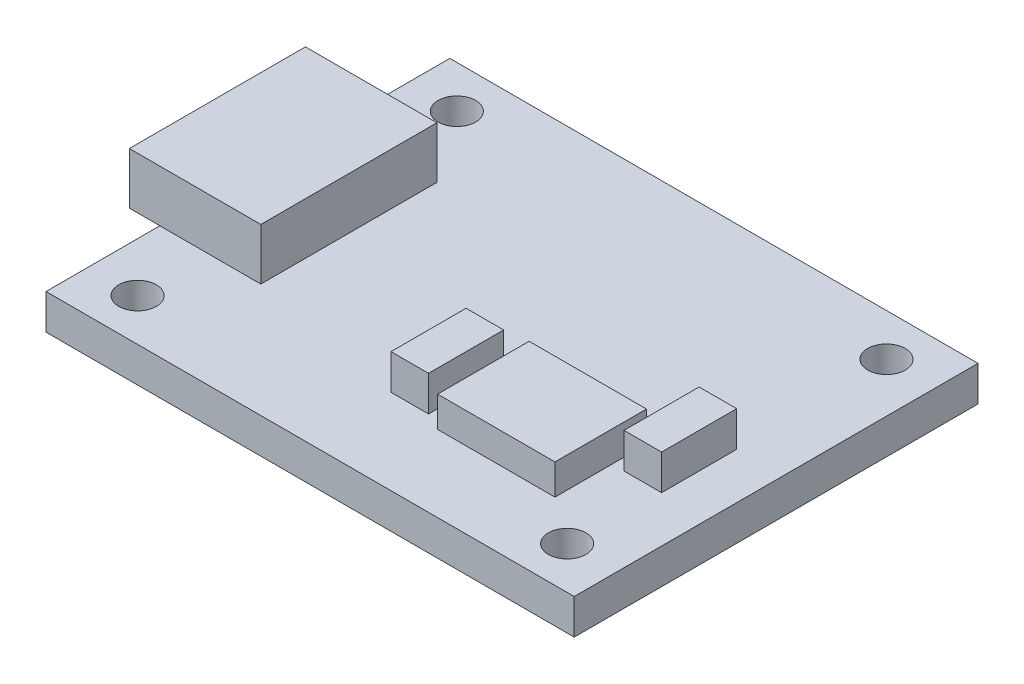
ISO-10303-21;
HEADER;
FILE_DESCRIPTION(('STEP AP214'),'2;1');
FILE_NAME('part.step','',(''),(''),'','','');
FILE_SCHEMA(('AUTOMOTIVE_DESIGN { 1 0 10303 214 1 1 1 1 }'));
ENDSEC;
DATA;
#1=APPLICATION_CONTEXT('core data for automotive mechanical design processes');
#2=APPLICATION_PROTOCOL_DEFINITION('international standard','automotive_design',2000,#1);
#3=PRODUCT_CONTEXT('',#1,'mechanical');
#4=PRODUCT('Part','Part','',(#3));
#5=PRODUCT_RELATED_PRODUCT_CATEGORY('part','',(#4));
#6=PRODUCT_DEFINITION_FORMATION('','',#4);
#7=PRODUCT_DEFINITION_CONTEXT('part definition',#1,'design');
#8=PRODUCT_DEFINITION('design','',#6,#7);
#9=PRODUCT_DEFINITION_SHAPE('','',#8);
#10=(LENGTH_UNIT() NAMED_UNIT(*) SI_UNIT(.MILLI.,.METRE.));
#11=(NAMED_UNIT(*) PLANE_ANGLE_UNIT() SI_UNIT($,.RADIAN.));
#12=(NAMED_UNIT(*) SI_UNIT($,.STERADIAN.) SOLID_ANGLE_UNIT());
#13=UNCERTAINTY_MEASURE_WITH_UNIT(LENGTH_MEASURE(1.E-05),#10,'distance_accuracy_value','');
#14=(GEOMETRIC_REPRESENTATION_CONTEXT(3) GLOBAL_UNCERTAINTY_ASSIGNED_CONTEXT((#13)) GLOBAL_UNIT_ASSIGNED_CONTEXT((#10,
#11,#12)) REPRESENTATION_CONTEXT('',''));
#15=CARTESIAN_POINT('',(0.,0.,0.));
#16=DIRECTION('',(0.,0.,1.));
#17=DIRECTION('',(1.,0.,0.));
#18=AXIS2_PLACEMENT_3D('',#15,#16,#17);
#19=CARTESIAN_POINT('',(0.,1.5,0.));
#20=DIRECTION('',(0.,-1.,0.));
#21=DIRECTION('',(0.,0.,-1.));
#22=AXIS2_PLACEMENT_3D('',#19,#20,#21);
#23=PLANE('',#22);
#24=CARTESIAN_POINT('',(9.15000000000001,1.5,-6.8));
#25=DIRECTION('',(0.,-1.,0.));
#26=DIRECTION('',(0.,0.,-1.));
#27=AXIS2_PLACEMENT_3D('',#24,#25,#26);
#28=CIRCLE('',#27,0.800000000000001);
#29=CARTESIAN_POINT('',(9.15000000000001,1.5,-7.6));
#30=VERTEX_POINT('',#29);
#31=EDGE_CURVE('E366',#30,#30,#28,.F.);
#32=ORIENTED_EDGE('',*,*,#31,.F.);
#33=EDGE_LOOP('',(#32));
#34=FACE_BOUND('',#33,.T.);
#35=CARTESIAN_POINT('',(9.15,1.5,6.8));
#36=DIRECTION('',(0.,-1.,0.));
#37=DIRECTION('',(0.,0.,-1.));
#38=AXIS2_PLACEMENT_3D('',#35,#36,#37);
#39=CIRCLE('',#38,0.800000000000002);
#40=CARTESIAN_POINT('',(9.15,1.5,6.));
#41=VERTEX_POINT('',#40);
#42=EDGE_CURVE('E664',#41,#41,#39,.F.);
#43=ORIENTED_EDGE('',*,*,#42,.F.);
#44=EDGE_LOOP('',(#43));
#45=FACE_BOUND('',#44,.T.);
#46=CARTESIAN_POINT('',(-9.15,1.5,6.8));
#47=DIRECTION('',(0.,-1.,0.));
#48=DIRECTION('',(0.,0.,-1.));
#49=AXIS2_PLACEMENT_3D('',#46,#47,#48);
#50=CIRCLE('',#49,0.800000000000001);
#51=CARTESIAN_POINT('',(-9.15,1.5,6.));
#52=VERTEX_POINT('',#51);
#53=EDGE_CURVE('E667',#52,#52,#50,.F.);
#54=ORIENTED_EDGE('',*,*,#53,.F.);
#55=EDGE_LOOP('',(#54));
#56=FACE_BOUND('',#55,.T.);
#57=CARTESIAN_POINT('',(-9.15,1.5,-6.8));
#58=DIRECTION('',(0.,-1.,0.));
#59=DIRECTION('',(0.,0.,-1.));
#60=AXIS2_PLACEMENT_3D('',#57,#58,#59);
#61=CIRCLE('',#60,0.800000000000001);
#62=CARTESIAN_POINT('',(-9.15,1.5,-7.6));
#63=VERTEX_POINT('',#62);
#64=EDGE_CURVE('E672',#63,#63,#61,.F.);
#65=ORIENTED_EDGE('',*,*,#64,.F.);
#66=EDGE_LOOP('',(#65));
#67=FACE_BOUND('',#66,.T.);
#68=DIRECTION('',(1.,0.,0.));
#69=VECTOR('',#68,1.);
#70=CARTESIAN_POINT('',(2.17519323471346,1.5,5.34627209754884));
#71=LINE('',#70,#69);
#72=CARTESIAN_POINT('',(2.17519323471346,1.5,5.34627209754884));
#73=VERTEX_POINT('',#72);
#74=CARTESIAN_POINT('',(7.17519323471346,1.5,5.34627209754884));
#75=VERTEX_POINT('',#74);
#76=EDGE_CURVE('E203',#73,#75,#71,.T.);
#77=ORIENTED_EDGE('',*,*,#76,.F.);
#78=DIRECTION('',(0.,0.,-1.));
#79=VECTOR('',#78,1.);
#80=CARTESIAN_POINT('',(2.17519323471346,1.5,5.34627209754884));
#81=LINE('',#80,#79);
#82=CARTESIAN_POINT('',(2.17519323471346,1.5,1.44627209754884));
#83=VERTEX_POINT('',#82);
#84=EDGE_CURVE('E216',#73,#83,#81,.T.);
#85=ORIENTED_EDGE('',*,*,#84,.T.);
#86=DIRECTION('',(1.,0.,0.));
#87=VECTOR('',#86,1.);
#88=CARTESIAN_POINT('',(2.17519323471346,1.5,1.44627209754884));
#89=LINE('',#88,#87);
#90=CARTESIAN_POINT('',(7.17519323471346,1.5,1.44627209754884));
#91=VERTEX_POINT('',#90);
#92=EDGE_CURVE('E227',#83,#91,#89,.T.);
#93=ORIENTED_EDGE('',*,*,#92,.T.);
#94=DIRECTION('',(0.,0.,-1.));
#95=VECTOR('',#94,1.);
#96=CARTESIAN_POINT('',(7.17519323471346,1.5,5.34627209754884));
#97=LINE('',#96,#95);
#98=EDGE_CURVE('E206',#75,#91,#97,.T.);
#99=ORIENTED_EDGE('',*,*,#98,.F.);
#100=EDGE_LOOP('',(#77,#85,#93,#99));
#101=FACE_BOUND('',#100,.T.);
#102=DIRECTION('',(1.,0.,0.));
#103=VECTOR('',#102,1.);
#104=CARTESIAN_POINT('',(0.,1.5,1.77023704739978));
#105=LINE('',#104,#103);
#106=CARTESIAN_POINT('',(-0.185122828486251,1.5,1.77023704739978));
#107=VERTEX_POINT('',#106);
#108=CARTESIAN_POINT('',(1.41487717151375,1.5,1.77023704739978));
#109=VERTEX_POINT('',#108);
#110=EDGE_CURVE('E286',#107,#109,#105,.T.);
#111=ORIENTED_EDGE('',*,*,#110,.T.);
#112=DIRECTION('',(0.,0.,1.));
#113=VECTOR('',#112,1.);
#114=CARTESIAN_POINT('',(1.41487717151375,1.5,0.));
#115=LINE('',#114,#113);
#116=CARTESIAN_POINT('',(1.41487717151375,1.5,4.97023704739978));
#117=VERTEX_POINT('',#116);
#118=EDGE_CURVE('E272',#109,#117,#115,.T.);
#119=ORIENTED_EDGE('',*,*,#118,.T.);
#120=DIRECTION('',(1.,0.,0.));
#121=VECTOR('',#120,1.);
#122=CARTESIAN_POINT('',(0.,1.5,4.97023704739978));
#123=LINE('',#122,#121);
#124=CARTESIAN_POINT('',(-0.185122828486251,1.5,4.97023704739978));
#125=VERTEX_POINT('',#124);
#126=EDGE_CURVE('E277',#125,#117,#123,.T.);
#127=ORIENTED_EDGE('',*,*,#126,.F.);
#128=DIRECTION('',(0.,0.,1.));
#129=VECTOR('',#128,1.);
#130=CARTESIAN_POINT('',(-0.185122828486251,1.5,0.));
#131=LINE('',#130,#129);
#132=EDGE_CURVE('E288',#107,#125,#131,.T.);
#133=ORIENTED_EDGE('',*,*,#132,.F.);
#134=EDGE_LOOP('',(#111,#119,#127,#133));
#135=FACE_BOUND('',#134,.T.);
#136=DIRECTION('',(1.,0.,0.));
#137=VECTOR('',#136,1.);
#138=CARTESIAN_POINT('',(0.,1.5,2.91074558049023));
#139=LINE('',#138,#137);
#140=CARTESIAN_POINT('',(7.68259738217945,1.5,2.91074558049023));
#141=VERTEX_POINT('',#140);
#142=CARTESIAN_POINT('',(9.28259738217945,1.5,2.91074558049023));
#143=VERTEX_POINT('',#142);
#144=EDGE_CURVE('E240',#141,#143,#139,.T.);
#145=ORIENTED_EDGE('',*,*,#144,.F.);
#146=DIRECTION('',(0.,0.,-1.));
#147=VECTOR('',#146,1.);
#148=CARTESIAN_POINT('',(7.68259738217945,1.5,0.));
#149=LINE('',#148,#147);
#150=CARTESIAN_POINT('',(7.68259738217945,1.5,-0.289254419509775));
#151=VERTEX_POINT('',#150);
#152=EDGE_CURVE('E245',#141,#151,#149,.T.);
#153=ORIENTED_EDGE('',*,*,#152,.T.);
#154=DIRECTION('',(1.,0.,0.));
#155=VECTOR('',#154,1.);
#156=CARTESIAN_POINT('',(0.,1.5,-0.289254419509775));
#157=LINE('',#156,#155);
#158=CARTESIAN_POINT('',(9.28259738217945,1.5,-0.289254419509775));
#159=VERTEX_POINT('',#158);
#160=EDGE_CURVE('E259',#151,#159,#157,.T.);
#161=ORIENTED_EDGE('',*,*,#160,.T.);
#162=DIRECTION('',(0.,0.,-1.));
#163=VECTOR('',#162,1.);
#164=CARTESIAN_POINT('',(9.28259738217945,1.5,0.));
#165=LINE('',#164,#163);
#166=EDGE_CURVE('E256',#143,#159,#165,.T.);
#167=ORIENTED_EDGE('',*,*,#166,.F.);
#168=EDGE_LOOP('',(#145,#153,#161,#167));
#169=FACE_BOUND('',#168,.T.);
#170=DIRECTION('',(1.,0.,0.));
#171=VECTOR('',#170,1.);
#172=CARTESIAN_POINT('',(-6.95,1.5,3.75));
#173=LINE('',#172,#171);
#174=CARTESIAN_POINT('',(-11.25,1.5,3.75));
#175=VERTEX_POINT('',#174);
#176=CARTESIAN_POINT('',(-6.95,1.5,3.75));
#177=VERTEX_POINT('',#176);
#178=EDGE_CURVE('E365',#175,#177,#173,.T.);
#179=ORIENTED_EDGE('',*,*,#178,.F.);
#180=DIRECTION('',(0.,0.,1.));
#181=VECTOR('',#180,1.);
#182=CARTESIAN_POINT('',(-11.25,1.5,-8.6));
#183=LINE('',#182,#181);
#184=CARTESIAN_POINT('',(-11.25,1.5,8.6));
#185=VERTEX_POINT('',#184);
#186=EDGE_CURVE('E309',#175,#185,#183,.T.);
#187=ORIENTED_EDGE('',*,*,#186,.T.);
#188=DIRECTION('',(1.,0.,0.));
#189=VECTOR('',#188,1.);
#190=CARTESIAN_POINT('',(11.25,1.5,8.6));
#191=LINE('',#190,#189);
#192=CARTESIAN_POINT('',(11.25,1.5,8.6));
#193=VERTEX_POINT('',#192);
#194=EDGE_CURVE('E307',#185,#193,#191,.T.);
#195=ORIENTED_EDGE('',*,*,#194,.T.);
#196=DIRECTION('',(0.,0.,-1.));
#197=VECTOR('',#196,1.);
#198=CARTESIAN_POINT('',(11.25,1.5,-8.6));
#199=LINE('',#198,#197);
#200=CARTESIAN_POINT('',(11.25,1.5,-8.6));
#201=VERTEX_POINT('',#200);
#202=EDGE_CURVE('E311',#193,#201,#199,.T.);
#203=ORIENTED_EDGE('',*,*,#202,.T.);
#204=DIRECTION('',(-1.,0.,0.));
#205=VECTOR('',#204,1.);
#206=CARTESIAN_POINT('',(11.25,1.5,-8.6));
#207=LINE('',#206,#205);
#208=CARTESIAN_POINT('',(-11.25,1.5,-8.6));
#209=VERTEX_POINT('',#208);
#210=EDGE_CURVE('E313',#201,#209,#207,.T.);
#211=ORIENTED_EDGE('',*,*,#210,.T.);
#212=CARTESIAN_POINT('',(-11.25,1.5,-3.75));
#213=VERTEX_POINT('',#212);
#214=EDGE_CURVE('E305',#209,#213,#183,.T.);
#215=ORIENTED_EDGE('',*,*,#214,.T.);
#216=DIRECTION('',(-1.,0.,0.));
#217=VECTOR('',#216,1.);
#218=CARTESIAN_POINT('',(-6.95,1.5,-3.75));
#219=LINE('',#218,#217);
#220=CARTESIAN_POINT('',(-6.95,1.5,-3.75));
#221=VERTEX_POINT('',#220);
#222=EDGE_CURVE('E55',#221,#213,#219,.T.);
#223=ORIENTED_EDGE('',*,*,#222,.F.);
#224=DIRECTION('',(0.,0.,-1.));
#225=VECTOR('',#224,1.);
#226=CARTESIAN_POINT('',(-6.95,1.5,3.75));
#227=LINE('',#226,#225);
#228=EDGE_CURVE('E50',#177,#221,#227,.T.);
#229=ORIENTED_EDGE('',*,*,#228,.F.);
#230=EDGE_LOOP('',(#179,#187,#195,#203,#211,#215,#223,#229));
#231=FACE_BOUND('',#230,.T.);
#232=ADVANCED_FACE('F35',(#34,#45,#56,#67,#101,#135,#169,#231),#23,.F.);
#233=CARTESIAN_POINT('',(-11.25,1.5,-8.6));
#234=DIRECTION('',(1.,0.,0.));
#235=DIRECTION('',(0.,0.,-1.));
#236=AXIS2_PLACEMENT_3D('',#233,#234,#235);
#237=PLANE('',#236);
#238=DIRECTION('',(0.,0.,1.));
#239=VECTOR('',#238,1.);
#240=CARTESIAN_POINT('',(-11.25,0.,-8.6));
#241=LINE('',#240,#239);
#242=CARTESIAN_POINT('',(-11.25,0.,-8.6));
#243=VERTEX_POINT('',#242);
#244=CARTESIAN_POINT('',(-11.25,0.,8.6));
#245=VERTEX_POINT('',#244);
#246=EDGE_CURVE('E304',#243,#245,#241,.T.);
#247=ORIENTED_EDGE('',*,*,#246,.T.);
#248=DIRECTION('',(0.,-1.,0.));
#249=VECTOR('',#248,1.);
#250=CARTESIAN_POINT('',(-11.25,1.5,8.6));
#251=LINE('',#250,#249);
#252=EDGE_CURVE('E11',#185,#245,#251,.T.);
#253=ORIENTED_EDGE('',*,*,#252,.F.);
#254=ORIENTED_EDGE('',*,*,#186,.F.);
#255=EDGE_CURVE('E308',#213,#175,#183,.T.);
#256=ORIENTED_EDGE('',*,*,#255,.F.);
#257=ORIENTED_EDGE('',*,*,#214,.F.);
#258=DIRECTION('',(0.,-1.,0.));
#259=VECTOR('',#258,1.);
#260=CARTESIAN_POINT('',(-11.25,1.5,-8.6));
#261=LINE('',#260,#259);
#262=EDGE_CURVE('E315',#209,#243,#261,.T.);
#263=ORIENTED_EDGE('',*,*,#262,.T.);
#264=EDGE_LOOP('',(#247,#253,#254,#256,#257,#263));
#265=FACE_BOUND('',#264,.T.);
#266=ADVANCED_FACE('F37',(#265),#237,.F.);
#267=CARTESIAN_POINT('',(11.25,1.5,8.6));
#268=DIRECTION('',(0.,0.,-1.));
#269=DIRECTION('',(-1.,0.,0.));
#270=AXIS2_PLACEMENT_3D('',#267,#268,#269);
#271=PLANE('',#270);
#272=DIRECTION('',(1.,0.,0.));
#273=VECTOR('',#272,1.);
#274=CARTESIAN_POINT('',(11.25,0.,8.6));
#275=LINE('',#274,#273);
#276=CARTESIAN_POINT('',(11.25,0.,8.6));
#277=VERTEX_POINT('',#276);
#278=EDGE_CURVE('E318',#245,#277,#275,.T.);
#279=ORIENTED_EDGE('',*,*,#278,.T.);
#280=DIRECTION('',(0.,-1.,0.));
#281=VECTOR('',#280,1.);
#282=CARTESIAN_POINT('',(11.25,1.5,8.6));
#283=LINE('',#282,#281);
#284=EDGE_CURVE('E43',#193,#277,#283,.T.);
#285=ORIENTED_EDGE('',*,*,#284,.F.);
#286=ORIENTED_EDGE('',*,*,#194,.F.);
#287=ORIENTED_EDGE('',*,*,#252,.T.);
#288=EDGE_LOOP('',(#279,#285,#286,#287));
#289=FACE_BOUND('',#288,.T.);
#290=ADVANCED_FACE('F384',(#289),#271,.F.);
#291=CARTESIAN_POINT('',(11.25,1.5,-8.6));
#292=DIRECTION('',(-1.,0.,0.));
#293=DIRECTION('',(0.,0.,1.));
#294=AXIS2_PLACEMENT_3D('',#291,#292,#293);
#295=PLANE('',#294);
#296=DIRECTION('',(0.,0.,-1.));
#297=VECTOR('',#296,1.);
#298=CARTESIAN_POINT('',(11.25,0.,-8.6));
#299=LINE('',#298,#297);
#300=CARTESIAN_POINT('',(11.25,0.,-8.6));
#301=VERTEX_POINT('',#300);
#302=EDGE_CURVE('E320',#277,#301,#299,.T.);
#303=ORIENTED_EDGE('',*,*,#302,.T.);
#304=DIRECTION('',(0.,-1.,0.));
#305=VECTOR('',#304,1.);
#306=CARTESIAN_POINT('',(11.25,1.5,-8.6));
#307=LINE('',#306,#305);
#308=EDGE_CURVE('E326',#201,#301,#307,.T.);
#309=ORIENTED_EDGE('',*,*,#308,.F.);
#310=ORIENTED_EDGE('',*,*,#202,.F.);
#311=ORIENTED_EDGE('',*,*,#284,.T.);
#312=EDGE_LOOP('',(#303,#309,#310,#311));
#313=FACE_BOUND('',#312,.T.);
#314=ADVANCED_FACE('F333',(#313),#295,.F.);
#315=CARTESIAN_POINT('',(11.25,1.5,-8.6));
#316=DIRECTION('',(0.,0.,1.));
#317=DIRECTION('',(1.,0.,0.));
#318=AXIS2_PLACEMENT_3D('',#315,#316,#317);
#319=PLANE('',#318);
#320=DIRECTION('',(-1.,0.,0.));
#321=VECTOR('',#320,1.);
#322=CARTESIAN_POINT('',(11.25,0.,-8.6));
#323=LINE('',#322,#321);
#324=EDGE_CURVE('E322',#301,#243,#323,.T.);
#325=ORIENTED_EDGE('',*,*,#324,.T.);
#326=ORIENTED_EDGE('',*,*,#262,.F.);
#327=ORIENTED_EDGE('',*,*,#210,.F.);
#328=ORIENTED_EDGE('',*,*,#308,.T.);
#329=EDGE_LOOP('',(#325,#326,#327,#328));
#330=FACE_BOUND('',#329,.T.);
#331=ADVANCED_FACE('F343',(#330),#319,.F.);
#332=CARTESIAN_POINT('',(0.,0.,0.));
#333=DIRECTION('',(0.,-1.,0.));
#334=DIRECTION('',(0.,0.,-1.));
#335=AXIS2_PLACEMENT_3D('',#332,#333,#334);
#336=PLANE('',#335);
#337=CARTESIAN_POINT('',(9.15000000000001,0.,-6.8));
#338=DIRECTION('',(0.,1.,0.));
#339=DIRECTION('',(0.,0.,-1.));
#340=AXIS2_PLACEMENT_3D('',#337,#338,#339);
#341=CIRCLE('',#340,0.800000000000001);
#342=CARTESIAN_POINT('',(9.15000000000001,0.,-7.6));
#343=VERTEX_POINT('',#342);
#344=EDGE_CURVE('E662',#343,#343,#341,.T.);
#345=ORIENTED_EDGE('',*,*,#344,.T.);
#346=EDGE_LOOP('',(#345));
#347=FACE_BOUND('',#346,.T.);
#348=CARTESIAN_POINT('',(9.15,0.,6.8));
#349=DIRECTION('',(0.,1.,0.));
#350=DIRECTION('',(0.,0.,-1.));
#351=AXIS2_PLACEMENT_3D('',#348,#349,#350);
#352=CIRCLE('',#351,0.800000000000002);
#353=CARTESIAN_POINT('',(9.15,0.,6.));
#354=VERTEX_POINT('',#353);
#355=EDGE_CURVE('E680',#354,#354,#352,.T.);
#356=ORIENTED_EDGE('',*,*,#355,.T.);
#357=EDGE_LOOP('',(#356));
#358=FACE_BOUND('',#357,.T.);
#359=CARTESIAN_POINT('',(-9.15,0.,6.8));
#360=DIRECTION('',(0.,1.,0.));
#361=DIRECTION('',(0.,0.,1.));
#362=AXIS2_PLACEMENT_3D('',#359,#360,#361);
#363=CIRCLE('',#362,0.800000000000001);
#364=CARTESIAN_POINT('',(-9.15,0.,7.6));
#365=VERTEX_POINT('',#364);
#366=EDGE_CURVE('E678',#365,#365,#363,.T.);
#367=ORIENTED_EDGE('',*,*,#366,.T.);
#368=EDGE_LOOP('',(#367));
#369=FACE_BOUND('',#368,.T.);
#370=CARTESIAN_POINT('',(-9.15,0.,-6.8));
#371=DIRECTION('',(0.,1.,0.));
#372=DIRECTION('',(0.,0.,1.));
#373=AXIS2_PLACEMENT_3D('',#370,#371,#372);
#374=CIRCLE('',#373,0.800000000000001);
#375=CARTESIAN_POINT('',(-9.15,0.,-6.));
#376=VERTEX_POINT('',#375);
#377=EDGE_CURVE('E675',#376,#376,#374,.T.);
#378=ORIENTED_EDGE('',*,*,#377,.T.);
#379=EDGE_LOOP('',(#378));
#380=FACE_BOUND('',#379,.T.);
#381=ORIENTED_EDGE('',*,*,#246,.F.);
#382=ORIENTED_EDGE('',*,*,#324,.F.);
#383=ORIENTED_EDGE('',*,*,#302,.F.);
#384=ORIENTED_EDGE('',*,*,#278,.F.);
#385=EDGE_LOOP('',(#381,#382,#383,#384));
#386=FACE_BOUND('',#385,.T.);
#387=ADVANCED_FACE('F340',(#347,#358,#369,#380,#386),#336,.T.);
#388=CARTESIAN_POINT('',(1.41487717151375,3.,0.));
#389=DIRECTION('',(1.,0.,0.));
#390=DIRECTION('',(0.,0.,-1.));
#391=AXIS2_PLACEMENT_3D('',#388,#389,#390);
#392=PLANE('',#391);
#393=ORIENTED_EDGE('',*,*,#118,.F.);
#394=DIRECTION('',(0.,-1.,0.));
#395=VECTOR('',#394,1.);
#396=CARTESIAN_POINT('',(1.41487717151375,3.,1.77023704739978));
#397=LINE('',#396,#395);
#398=CARTESIAN_POINT('',(1.41487717151375,3.,1.77023704739978));
#399=VERTEX_POINT('',#398);
#400=EDGE_CURVE('E301',#399,#109,#397,.T.);
#401=ORIENTED_EDGE('',*,*,#400,.F.);
#402=DIRECTION('',(0.,0.,1.));
#403=VECTOR('',#402,1.);
#404=CARTESIAN_POINT('',(1.41487717151375,3.,0.));
#405=LINE('',#404,#403);
#406=CARTESIAN_POINT('',(1.41487717151375,3.,4.97023704739978));
#407=VERTEX_POINT('',#406);
#408=EDGE_CURVE('E273',#399,#407,#405,.T.);
#409=ORIENTED_EDGE('',*,*,#408,.T.);
#410=DIRECTION('',(0.,-1.,0.));
#411=VECTOR('',#410,1.);
#412=CARTESIAN_POINT('',(1.41487717151375,3.,4.97023704739978));
#413=LINE('',#412,#411);
#414=EDGE_CURVE('E284',#407,#117,#413,.T.);
#415=ORIENTED_EDGE('',*,*,#414,.T.);
#416=EDGE_LOOP('',(#393,#401,#409,#415));
#417=FACE_BOUND('',#416,.T.);
#418=ADVANCED_FACE('F389',(#417),#392,.T.);
#419=CARTESIAN_POINT('',(0.,3.,1.77023704739978));
#420=DIRECTION('',(0.,0.,-1.));
#421=DIRECTION('',(-1.,0.,0.));
#422=AXIS2_PLACEMENT_3D('',#419,#420,#421);
#423=PLANE('',#422);
#424=ORIENTED_EDGE('',*,*,#110,.F.);
#425=DIRECTION('',(0.,-1.,0.));
#426=VECTOR('',#425,1.);
#427=CARTESIAN_POINT('',(-0.185122828486251,3.,1.77023704739978));
#428=LINE('',#427,#426);
#429=CARTESIAN_POINT('',(-0.185122828486251,3.,1.77023704739978));
#430=VERTEX_POINT('',#429);
#431=EDGE_CURVE('E298',#430,#107,#428,.T.);
#432=ORIENTED_EDGE('',*,*,#431,.F.);
#433=DIRECTION('',(1.,0.,0.));
#434=VECTOR('',#433,1.);
#435=CARTESIAN_POINT('',(0.,3.,1.77023704739978));
#436=LINE('',#435,#434);
#437=EDGE_CURVE('E276',#430,#399,#436,.T.);
#438=ORIENTED_EDGE('',*,*,#437,.T.);
#439=ORIENTED_EDGE('',*,*,#400,.T.);
#440=EDGE_LOOP('',(#424,#432,#438,#439));
#441=FACE_BOUND('',#440,.T.);
#442=ADVANCED_FACE('F421',(#441),#423,.T.);
#443=CARTESIAN_POINT('',(-0.185122828486251,3.,0.));
#444=DIRECTION('',(1.,0.,0.));
#445=DIRECTION('',(0.,0.,-1.));
#446=AXIS2_PLACEMENT_3D('',#443,#444,#445);
#447=PLANE('',#446);
#448=ORIENTED_EDGE('',*,*,#132,.T.);
#449=DIRECTION('',(0.,-1.,0.));
#450=VECTOR('',#449,1.);
#451=CARTESIAN_POINT('',(-0.185122828486251,3.,4.97023704739978));
#452=LINE('',#451,#450);
#453=CARTESIAN_POINT('',(-0.185122828486251,3.,4.97023704739978));
#454=VERTEX_POINT('',#453);
#455=EDGE_CURVE('E295',#454,#125,#452,.T.);
#456=ORIENTED_EDGE('',*,*,#455,.F.);
#457=DIRECTION('',(0.,0.,1.));
#458=VECTOR('',#457,1.);
#459=CARTESIAN_POINT('',(-0.185122828486251,3.,0.));
#460=LINE('',#459,#458);
#461=EDGE_CURVE('E280',#430,#454,#460,.T.);
#462=ORIENTED_EDGE('',*,*,#461,.F.);
#463=ORIENTED_EDGE('',*,*,#431,.T.);
#464=EDGE_LOOP('',(#448,#456,#462,#463));
#465=FACE_BOUND('',#464,.T.);
#466=ADVANCED_FACE('F428',(#465),#447,.F.);
#467=CARTESIAN_POINT('',(0.,3.,4.97023704739978));
#468=DIRECTION('',(0.,0.,-1.));
#469=DIRECTION('',(-1.,0.,0.));
#470=AXIS2_PLACEMENT_3D('',#467,#468,#469);
#471=PLANE('',#470);
#472=ORIENTED_EDGE('',*,*,#126,.T.);
#473=ORIENTED_EDGE('',*,*,#414,.F.);
#474=DIRECTION('',(1.,0.,0.));
#475=VECTOR('',#474,1.);
#476=CARTESIAN_POINT('',(0.,3.,4.97023704739978));
#477=LINE('',#476,#475);
#478=EDGE_CURVE('E282',#454,#407,#477,.T.);
#479=ORIENTED_EDGE('',*,*,#478,.F.);
#480=ORIENTED_EDGE('',*,*,#455,.T.);
#481=EDGE_LOOP('',(#472,#473,#479,#480));
#482=FACE_BOUND('',#481,.T.);
#483=ADVANCED_FACE('F435',(#482),#471,.F.);
#484=CARTESIAN_POINT('',(0.,3.,0.));
#485=DIRECTION('',(0.,1.,0.));
#486=DIRECTION('',(0.,0.,1.));
#487=AXIS2_PLACEMENT_3D('',#484,#485,#486);
#488=PLANE('',#487);
#489=ORIENTED_EDGE('',*,*,#408,.F.);
#490=ORIENTED_EDGE('',*,*,#437,.F.);
#491=ORIENTED_EDGE('',*,*,#461,.T.);
#492=ORIENTED_EDGE('',*,*,#478,.T.);
#493=EDGE_LOOP('',(#489,#490,#491,#492));
#494=FACE_BOUND('',#493,.T.);
#495=ADVANCED_FACE('F443',(#494),#488,.T.);
#496=CARTESIAN_POINT('',(0.,3.,2.91074558049023));
#497=DIRECTION('',(0.,0.,-1.));
#498=DIRECTION('',(-1.,0.,0.));
#499=AXIS2_PLACEMENT_3D('',#496,#497,#498);
#500=PLANE('',#499);
#501=ORIENTED_EDGE('',*,*,#144,.T.);
#502=DIRECTION('',(0.,-1.,0.));
#503=VECTOR('',#502,1.);
#504=CARTESIAN_POINT('',(9.28259738217945,3.,2.91074558049023));
#505=LINE('',#504,#503);
#506=CARTESIAN_POINT('',(9.28259738217945,3.,2.91074558049023));
#507=VERTEX_POINT('',#506);
#508=EDGE_CURVE('E270',#507,#143,#505,.T.);
#509=ORIENTED_EDGE('',*,*,#508,.F.);
#510=DIRECTION('',(1.,0.,0.));
#511=VECTOR('',#510,1.);
#512=CARTESIAN_POINT('',(0.,3.,2.91074558049023));
#513=LINE('',#512,#511);
#514=CARTESIAN_POINT('',(7.68259738217945,3.,2.91074558049023));
#515=VERTEX_POINT('',#514);
#516=EDGE_CURVE('E241',#515,#507,#513,.T.);
#517=ORIENTED_EDGE('',*,*,#516,.F.);
#518=DIRECTION('',(0.,-1.,0.));
#519=VECTOR('',#518,1.);
#520=CARTESIAN_POINT('',(7.68259738217945,3.,2.91074558049023));
#521=LINE('',#520,#519);
#522=EDGE_CURVE('E253',#515,#141,#521,.T.);
#523=ORIENTED_EDGE('',*,*,#522,.T.);
#524=EDGE_LOOP('',(#501,#509,#517,#523));
#525=FACE_BOUND('',#524,.T.);
#526=ADVANCED_FACE('F451',(#525),#500,.F.);
#527=CARTESIAN_POINT('',(9.28259738217945,3.,0.));
#528=DIRECTION('',(-1.,0.,0.));
#529=DIRECTION('',(0.,0.,1.));
#530=AXIS2_PLACEMENT_3D('',#527,#528,#529);
#531=PLANE('',#530);
#532=ORIENTED_EDGE('',*,*,#166,.T.);
#533=DIRECTION('',(0.,-1.,0.));
#534=VECTOR('',#533,1.);
#535=CARTESIAN_POINT('',(9.28259738217945,3.,-0.289254419509775));
#536=LINE('',#535,#534);
#537=CARTESIAN_POINT('',(9.28259738217945,3.,-0.289254419509775));
#538=VERTEX_POINT('',#537);
#539=EDGE_CURVE('E268',#538,#159,#536,.T.);
#540=ORIENTED_EDGE('',*,*,#539,.F.);
#541=DIRECTION('',(0.,0.,-1.));
#542=VECTOR('',#541,1.);
#543=CARTESIAN_POINT('',(9.28259738217945,3.,0.));
#544=LINE('',#543,#542);
#545=EDGE_CURVE('E244',#507,#538,#544,.T.);
#546=ORIENTED_EDGE('',*,*,#545,.F.);
#547=ORIENTED_EDGE('',*,*,#508,.T.);
#548=EDGE_LOOP('',(#532,#540,#546,#547));
#549=FACE_BOUND('',#548,.T.);
#550=ADVANCED_FACE('F459',(#549),#531,.F.);
#551=CARTESIAN_POINT('',(0.,3.,-0.289254419509775));
#552=DIRECTION('',(0.,0.,-1.));
#553=DIRECTION('',(-1.,0.,0.));
#554=AXIS2_PLACEMENT_3D('',#551,#552,#553);
#555=PLANE('',#554);
#556=ORIENTED_EDGE('',*,*,#160,.F.);
#557=DIRECTION('',(0.,-1.,0.));
#558=VECTOR('',#557,1.);
#559=CARTESIAN_POINT('',(7.68259738217945,3.,-0.289254419509775));
#560=LINE('',#559,#558);
#561=CARTESIAN_POINT('',(7.68259738217945,3.,-0.289254419509775));
#562=VERTEX_POINT('',#561);
#563=EDGE_CURVE('E265',#562,#151,#560,.T.);
#564=ORIENTED_EDGE('',*,*,#563,.F.);
#565=DIRECTION('',(1.,0.,0.));
#566=VECTOR('',#565,1.);
#567=CARTESIAN_POINT('',(0.,3.,-0.289254419509775));
#568=LINE('',#567,#566);
#569=EDGE_CURVE('E247',#562,#538,#568,.T.);
#570=ORIENTED_EDGE('',*,*,#569,.T.);
#571=ORIENTED_EDGE('',*,*,#539,.T.);
#572=EDGE_LOOP('',(#556,#564,#570,#571));
#573=FACE_BOUND('',#572,.T.);
#574=ADVANCED_FACE('F467',(#573),#555,.T.);
#575=CARTESIAN_POINT('',(7.68259738217945,3.,0.));
#576=DIRECTION('',(-1.,0.,0.));
#577=DIRECTION('',(0.,0.,1.));
#578=AXIS2_PLACEMENT_3D('',#575,#576,#577);
#579=PLANE('',#578);
#580=ORIENTED_EDGE('',*,*,#152,.F.);
#581=ORIENTED_EDGE('',*,*,#522,.F.);
#582=DIRECTION('',(0.,0.,-1.));
#583=VECTOR('',#582,1.);
#584=CARTESIAN_POINT('',(7.68259738217945,3.,0.));
#585=LINE('',#584,#583);
#586=EDGE_CURVE('E250',#515,#562,#585,.T.);
#587=ORIENTED_EDGE('',*,*,#586,.T.);
#588=ORIENTED_EDGE('',*,*,#563,.T.);
#589=EDGE_LOOP('',(#580,#581,#587,#588));
#590=FACE_BOUND('',#589,.T.);
#591=ADVANCED_FACE('F475',(#590),#579,.T.);
#592=CARTESIAN_POINT('',(0.,3.,0.));
#593=DIRECTION('',(0.,1.,0.));
#594=DIRECTION('',(0.,0.,1.));
#595=AXIS2_PLACEMENT_3D('',#592,#593,#594);
#596=PLANE('',#595);
#597=ORIENTED_EDGE('',*,*,#516,.T.);
#598=ORIENTED_EDGE('',*,*,#545,.T.);
#599=ORIENTED_EDGE('',*,*,#569,.F.);
#600=ORIENTED_EDGE('',*,*,#586,.F.);
#601=EDGE_LOOP('',(#597,#598,#599,#600));
#602=FACE_BOUND('',#601,.T.);
#603=ADVANCED_FACE('F483',(#602),#596,.T.);
#604=CARTESIAN_POINT('',(2.17519323471346,2.8,5.34627209754884));
#605=DIRECTION('',(0.,0.,-1.));
#606=DIRECTION('',(-1.,0.,0.));
#607=AXIS2_PLACEMENT_3D('',#604,#605,#606);
#608=PLANE('',#607);
#609=ORIENTED_EDGE('',*,*,#76,.T.);
#610=DIRECTION('',(0.,-1.,0.));
#611=VECTOR('',#610,1.);
#612=CARTESIAN_POINT('',(7.17519323471346,2.8,5.34627209754884));
#613=LINE('',#612,#611);
#614=CARTESIAN_POINT('',(7.17519323471346,2.8,5.34627209754884));
#615=VERTEX_POINT('',#614);
#616=EDGE_CURVE('E238',#615,#75,#613,.T.);
#617=ORIENTED_EDGE('',*,*,#616,.F.);
#618=DIRECTION('',(1.,0.,0.));
#619=VECTOR('',#618,1.);
#620=CARTESIAN_POINT('',(2.17519323471346,2.8,5.34627209754884));
#621=LINE('',#620,#619);
#622=CARTESIAN_POINT('',(2.17519323471346,2.8,5.34627209754884));
#623=VERTEX_POINT('',#622);
#624=EDGE_CURVE('E212',#623,#615,#621,.T.);
#625=ORIENTED_EDGE('',*,*,#624,.F.);
#626=DIRECTION('',(0.,-1.,0.));
#627=VECTOR('',#626,1.);
#628=CARTESIAN_POINT('',(2.17519323471346,2.8,5.34627209754884));
#629=LINE('',#628,#627);
#630=EDGE_CURVE('E223',#623,#73,#629,.T.);
#631=ORIENTED_EDGE('',*,*,#630,.T.);
#632=EDGE_LOOP('',(#609,#617,#625,#631));
#633=FACE_BOUND('',#632,.T.);
#634=ADVANCED_FACE('F491',(#633),#608,.F.);
#635=CARTESIAN_POINT('',(7.17519323471346,2.8,5.34627209754884));
#636=DIRECTION('',(-1.,0.,0.));
#637=DIRECTION('',(0.,0.,1.));
#638=AXIS2_PLACEMENT_3D('',#635,#636,#637);
#639=PLANE('',#638);
#640=ORIENTED_EDGE('',*,*,#98,.T.);
#641=DIRECTION('',(0.,-1.,0.));
#642=VECTOR('',#641,1.);
#643=CARTESIAN_POINT('',(7.17519323471346,2.8,1.44627209754884));
#644=LINE('',#643,#642);
#645=CARTESIAN_POINT('',(7.17519323471346,2.8,1.44627209754884));
#646=VERTEX_POINT('',#645);
#647=EDGE_CURVE('E236',#646,#91,#644,.T.);
#648=ORIENTED_EDGE('',*,*,#647,.F.);
#649=DIRECTION('',(0.,0.,-1.));
#650=VECTOR('',#649,1.);
#651=CARTESIAN_POINT('',(7.17519323471346,2.8,5.34627209754884));
#652=LINE('',#651,#650);
#653=EDGE_CURVE('E215',#615,#646,#652,.T.);
#654=ORIENTED_EDGE('',*,*,#653,.F.);
#655=ORIENTED_EDGE('',*,*,#616,.T.);
#656=EDGE_LOOP('',(#640,#648,#654,#655));
#657=FACE_BOUND('',#656,.T.);
#658=ADVANCED_FACE('F499',(#657),#639,.F.);
#659=CARTESIAN_POINT('',(2.17519323471346,2.8,1.44627209754884));
#660=DIRECTION('',(0.,0.,-1.));
#661=DIRECTION('',(-1.,0.,0.));
#662=AXIS2_PLACEMENT_3D('',#659,#660,#661);
#663=PLANE('',#662);
#664=ORIENTED_EDGE('',*,*,#92,.F.);
#665=DIRECTION('',(0.,-1.,0.));
#666=VECTOR('',#665,1.);
#667=CARTESIAN_POINT('',(2.17519323471346,2.8,1.44627209754884));
#668=LINE('',#667,#666);
#669=CARTESIAN_POINT('',(2.17519323471346,2.8,1.44627209754884));
#670=VERTEX_POINT('',#669);
#671=EDGE_CURVE('E233',#670,#83,#668,.T.);
#672=ORIENTED_EDGE('',*,*,#671,.F.);
#673=DIRECTION('',(1.,0.,0.));
#674=VECTOR('',#673,1.);
#675=CARTESIAN_POINT('',(2.17519323471346,2.8,1.44627209754884));
#676=LINE('',#675,#674);
#677=EDGE_CURVE('E218',#670,#646,#676,.T.);
#678=ORIENTED_EDGE('',*,*,#677,.T.);
#679=ORIENTED_EDGE('',*,*,#647,.T.);
#680=EDGE_LOOP('',(#664,#672,#678,#679));
#681=FACE_BOUND('',#680,.T.);
#682=ADVANCED_FACE('F507',(#681),#663,.T.);
#683=CARTESIAN_POINT('',(2.17519323471346,2.8,5.34627209754884));
#684=DIRECTION('',(-1.,0.,0.));
#685=DIRECTION('',(0.,0.,1.));
#686=AXIS2_PLACEMENT_3D('',#683,#684,#685);
#687=PLANE('',#686);
#688=ORIENTED_EDGE('',*,*,#84,.F.);
#689=ORIENTED_EDGE('',*,*,#630,.F.);
#690=DIRECTION('',(0.,0.,-1.));
#691=VECTOR('',#690,1.);
#692=CARTESIAN_POINT('',(2.17519323471346,2.8,5.34627209754884));
#693=LINE('',#692,#691);
#694=EDGE_CURVE('E221',#623,#670,#693,.T.);
#695=ORIENTED_EDGE('',*,*,#694,.T.);
#696=ORIENTED_EDGE('',*,*,#671,.T.);
#697=EDGE_LOOP('',(#688,#689,#695,#696));
#698=FACE_BOUND('',#697,.T.);
#699=ADVANCED_FACE('F515',(#698),#687,.T.);
#700=CARTESIAN_POINT('',(0.,2.8,0.));
#701=DIRECTION('',(0.,1.,0.));
#702=DIRECTION('',(0.,0.,1.));
#703=AXIS2_PLACEMENT_3D('',#700,#701,#702);
#704=PLANE('',#703);
#705=ORIENTED_EDGE('',*,*,#624,.T.);
#706=ORIENTED_EDGE('',*,*,#653,.T.);
#707=ORIENTED_EDGE('',*,*,#677,.F.);
#708=ORIENTED_EDGE('',*,*,#694,.F.);
#709=EDGE_LOOP('',(#705,#706,#707,#708));
#710=FACE_BOUND('',#709,.T.);
#711=ADVANCED_FACE('F523',(#710),#704,.T.);
#712=CARTESIAN_POINT('',(0.,1.5,0.));
#713=DIRECTION('',(0.,1.,0.));
#714=DIRECTION('',(0.,0.,1.));
#715=AXIS2_PLACEMENT_3D('',#712,#713,#714);
#716=PLANE('',#715);
#717=CARTESIAN_POINT('',(-12.55,1.5,-3.75));
#718=VERTEX_POINT('',#717);
#719=EDGE_CURVE('E351',#213,#718,#219,.T.);
#720=ORIENTED_EDGE('',*,*,#719,.F.);
#721=ORIENTED_EDGE('',*,*,#255,.T.);
#722=CARTESIAN_POINT('',(-12.55,1.5,3.75));
#723=VERTEX_POINT('',#722);
#724=EDGE_CURVE('E367',#723,#175,#173,.T.);
#725=ORIENTED_EDGE('',*,*,#724,.F.);
#726=DIRECTION('',(0.,0.,1.));
#727=VECTOR('',#726,1.);
#728=CARTESIAN_POINT('',(-12.55,1.5,3.75));
#729=LINE('',#728,#727);
#730=EDGE_CURVE('E202',#718,#723,#729,.T.);
#731=ORIENTED_EDGE('',*,*,#730,.F.);
#732=EDGE_LOOP('',(#720,#721,#725,#731));
#733=FACE_BOUND('',#732,.T.);
#734=ADVANCED_FACE('F352',(#733),#716,.F.);
#735=CARTESIAN_POINT('',(-12.55,3.7,3.75));
#736=DIRECTION('',(1.,0.,0.));
#737=DIRECTION('',(0.,0.,-1.));
#738=AXIS2_PLACEMENT_3D('',#735,#736,#737);
#739=PLANE('',#738);
#740=ORIENTED_EDGE('',*,*,#730,.T.);
#741=DIRECTION('',(0.,-1.,0.));
#742=VECTOR('',#741,1.);
#743=CARTESIAN_POINT('',(-12.55,3.7,3.75));
#744=LINE('',#743,#742);
#745=CARTESIAN_POINT('',(-12.55,3.7,3.75));
#746=VERTEX_POINT('',#745);
#747=EDGE_CURVE('E183',#746,#723,#744,.T.);
#748=ORIENTED_EDGE('',*,*,#747,.F.);
#749=DIRECTION('',(0.,0.,1.));
#750=VECTOR('',#749,1.);
#751=CARTESIAN_POINT('',(-12.55,3.7,3.75));
#752=LINE('',#751,#750);
#753=CARTESIAN_POINT('',(-12.55,3.7,-3.75));
#754=VERTEX_POINT('',#753);
#755=EDGE_CURVE('E190',#754,#746,#752,.T.);
#756=ORIENTED_EDGE('',*,*,#755,.F.);
#757=DIRECTION('',(0.,-1.,0.));
#758=VECTOR('',#757,1.);
#759=CARTESIAN_POINT('',(-12.55,3.7,-3.75));
#760=LINE('',#759,#758);
#761=EDGE_CURVE('E361',#754,#718,#760,.T.);
#762=ORIENTED_EDGE('',*,*,#761,.T.);
#763=EDGE_LOOP('',(#740,#748,#756,#762));
#764=FACE_BOUND('',#763,.T.);
#765=ADVANCED_FACE('F200',(#764),#739,.F.);
#766=CARTESIAN_POINT('',(-6.95,3.7,3.75));
#767=DIRECTION('',(0.,0.,-1.));
#768=DIRECTION('',(-1.,0.,0.));
#769=AXIS2_PLACEMENT_3D('',#766,#767,#768);
#770=PLANE('',#769);
#771=ORIENTED_EDGE('',*,*,#724,.T.);
#772=ORIENTED_EDGE('',*,*,#178,.T.);
#773=DIRECTION('',(0.,-1.,0.));
#774=VECTOR('',#773,1.);
#775=CARTESIAN_POINT('',(-6.95,3.7,3.75));
#776=LINE('',#775,#774);
#777=CARTESIAN_POINT('',(-6.95,3.7,3.75));
#778=VERTEX_POINT('',#777);
#779=EDGE_CURVE('E186',#778,#177,#776,.T.);
#780=ORIENTED_EDGE('',*,*,#779,.F.);
#781=DIRECTION('',(1.,0.,0.));
#782=VECTOR('',#781,1.);
#783=CARTESIAN_POINT('',(-6.95,3.7,3.75));
#784=LINE('',#783,#782);
#785=EDGE_CURVE('E178',#746,#778,#784,.T.);
#786=ORIENTED_EDGE('',*,*,#785,.F.);
#787=ORIENTED_EDGE('',*,*,#747,.T.);
#788=EDGE_LOOP('',(#771,#772,#780,#786,#787));
#789=FACE_BOUND('',#788,.T.);
#790=ADVANCED_FACE('F181',(#789),#770,.F.);
#791=CARTESIAN_POINT('',(-6.95,3.7,3.75));
#792=DIRECTION('',(-1.,0.,0.));
#793=DIRECTION('',(0.,0.,1.));
#794=AXIS2_PLACEMENT_3D('',#791,#792,#793);
#795=PLANE('',#794);
#796=ORIENTED_EDGE('',*,*,#228,.T.);
#797=DIRECTION('',(0.,-1.,0.));
#798=VECTOR('',#797,1.);
#799=CARTESIAN_POINT('',(-6.95,3.7,-3.75));
#800=LINE('',#799,#798);
#801=CARTESIAN_POINT('',(-6.95,3.7,-3.75));
#802=VERTEX_POINT('',#801);
#803=EDGE_CURVE('E208',#802,#221,#800,.T.);
#804=ORIENTED_EDGE('',*,*,#803,.F.);
#805=DIRECTION('',(0.,0.,-1.));
#806=VECTOR('',#805,1.);
#807=CARTESIAN_POINT('',(-6.95,3.7,3.75));
#808=LINE('',#807,#806);
#809=EDGE_CURVE('E189',#778,#802,#808,.T.);
#810=ORIENTED_EDGE('',*,*,#809,.F.);
#811=ORIENTED_EDGE('',*,*,#779,.T.);
#812=EDGE_LOOP('',(#796,#804,#810,#811));
#813=FACE_BOUND('',#812,.T.);
#814=ADVANCED_FACE('F369',(#813),#795,.F.);
#815=CARTESIAN_POINT('',(-6.95,3.7,-3.75));
#816=DIRECTION('',(0.,0.,1.));
#817=DIRECTION('',(1.,0.,0.));
#818=AXIS2_PLACEMENT_3D('',#815,#816,#817);
#819=PLANE('',#818);
#820=ORIENTED_EDGE('',*,*,#222,.T.);
#821=ORIENTED_EDGE('',*,*,#719,.T.);
#822=ORIENTED_EDGE('',*,*,#761,.F.);
#823=DIRECTION('',(-1.,0.,0.));
#824=VECTOR('',#823,1.);
#825=CARTESIAN_POINT('',(-6.95,3.7,-3.75));
#826=LINE('',#825,#824);
#827=EDGE_CURVE('E195',#802,#754,#826,.T.);
#828=ORIENTED_EDGE('',*,*,#827,.F.);
#829=ORIENTED_EDGE('',*,*,#803,.T.);
#830=EDGE_LOOP('',(#820,#821,#822,#828,#829));
#831=FACE_BOUND('',#830,.T.);
#832=ADVANCED_FACE('F356',(#831),#819,.F.);
#833=CARTESIAN_POINT('',(0.,3.7,0.));
#834=DIRECTION('',(0.,1.,0.));
#835=DIRECTION('',(0.,0.,1.));
#836=AXIS2_PLACEMENT_3D('',#833,#834,#835);
#837=PLANE('',#836);
#838=ORIENTED_EDGE('',*,*,#755,.T.);
#839=ORIENTED_EDGE('',*,*,#785,.T.);
#840=ORIENTED_EDGE('',*,*,#809,.T.);
#841=ORIENTED_EDGE('',*,*,#827,.T.);
#842=EDGE_LOOP('',(#838,#839,#840,#841));
#843=FACE_BOUND('',#842,.T.);
#844=ADVANCED_FACE('F193',(#843),#837,.T.);
#845=CARTESIAN_POINT('',(-9.15,3.7,-6.8));
#846=DIRECTION('',(0.,-1.,0.));
#847=DIRECTION('',(0.,0.,-1.));
#848=AXIS2_PLACEMENT_3D('',#845,#846,#847);
#849=CYLINDRICAL_SURFACE('',#848,0.800000000000001);
#850=ORIENTED_EDGE('',*,*,#377,.F.);
#851=EDGE_LOOP('',(#850));
#852=FACE_BOUND('',#851,.T.);
#853=ORIENTED_EDGE('',*,*,#64,.T.);
#854=EDGE_LOOP('',(#853));
#855=FACE_BOUND('',#854,.T.);
#856=ADVANCED_FACE('F566',(#852,#855),#849,.F.);
#857=CARTESIAN_POINT('',(-9.15,3.7,6.8));
#858=DIRECTION('',(0.,-1.,0.));
#859=DIRECTION('',(0.,0.,-1.));
#860=AXIS2_PLACEMENT_3D('',#857,#858,#859);
#861=CYLINDRICAL_SURFACE('',#860,0.800000000000001);
#862=ORIENTED_EDGE('',*,*,#366,.F.);
#863=EDGE_LOOP('',(#862));
#864=FACE_BOUND('',#863,.T.);
#865=ORIENTED_EDGE('',*,*,#53,.T.);
#866=EDGE_LOOP('',(#865));
#867=FACE_BOUND('',#866,.T.);
#868=ADVANCED_FACE('F625',(#864,#867),#861,.F.);
#869=CARTESIAN_POINT('',(9.15,3.7,6.8));
#870=DIRECTION('',(0.,-1.,0.));
#871=DIRECTION('',(0.,0.,-1.));
#872=AXIS2_PLACEMENT_3D('',#869,#870,#871);
#873=CYLINDRICAL_SURFACE('',#872,0.800000000000002);
#874=ORIENTED_EDGE('',*,*,#355,.F.);
#875=EDGE_LOOP('',(#874));
#876=FACE_BOUND('',#875,.T.);
#877=ORIENTED_EDGE('',*,*,#42,.T.);
#878=EDGE_LOOP('',(#877));
#879=FACE_BOUND('',#878,.T.);
#880=ADVANCED_FACE('F632',(#876,#879),#873,.F.);
#881=CARTESIAN_POINT('',(9.15000000000001,3.7,-6.8));
#882=DIRECTION('',(0.,-1.,0.));
#883=DIRECTION('',(0.,0.,-1.));
#884=AXIS2_PLACEMENT_3D('',#881,#882,#883);
#885=CYLINDRICAL_SURFACE('',#884,0.800000000000001);
#886=ORIENTED_EDGE('',*,*,#344,.F.);
#887=EDGE_LOOP('',(#886));
#888=FACE_BOUND('',#887,.T.);
#889=ORIENTED_EDGE('',*,*,#31,.T.);
#890=EDGE_LOOP('',(#889));
#891=FACE_BOUND('',#890,.T.);
#892=ADVANCED_FACE('F640',(#888,#891),#885,.F.);
#893=CLOSED_SHELL('',(#232,#266,#290,#314,#331,#387,#418,#442,#466,#483,#495,#526,#550,#574,
#591,#603,#634,#658,#682,#699,#711,#734,#765,#790,#814,#832,#844,#856,#868,#880,#892));
#894=MANIFOLD_SOLID_BREP('B2',#893);
#895=ADVANCED_BREP_SHAPE_REPRESENTATION('',(#18,#894),#14);
#896=SHAPE_DEFINITION_REPRESENTATION(#9,#895);
ENDSEC;
END-ISO-10303-21;
